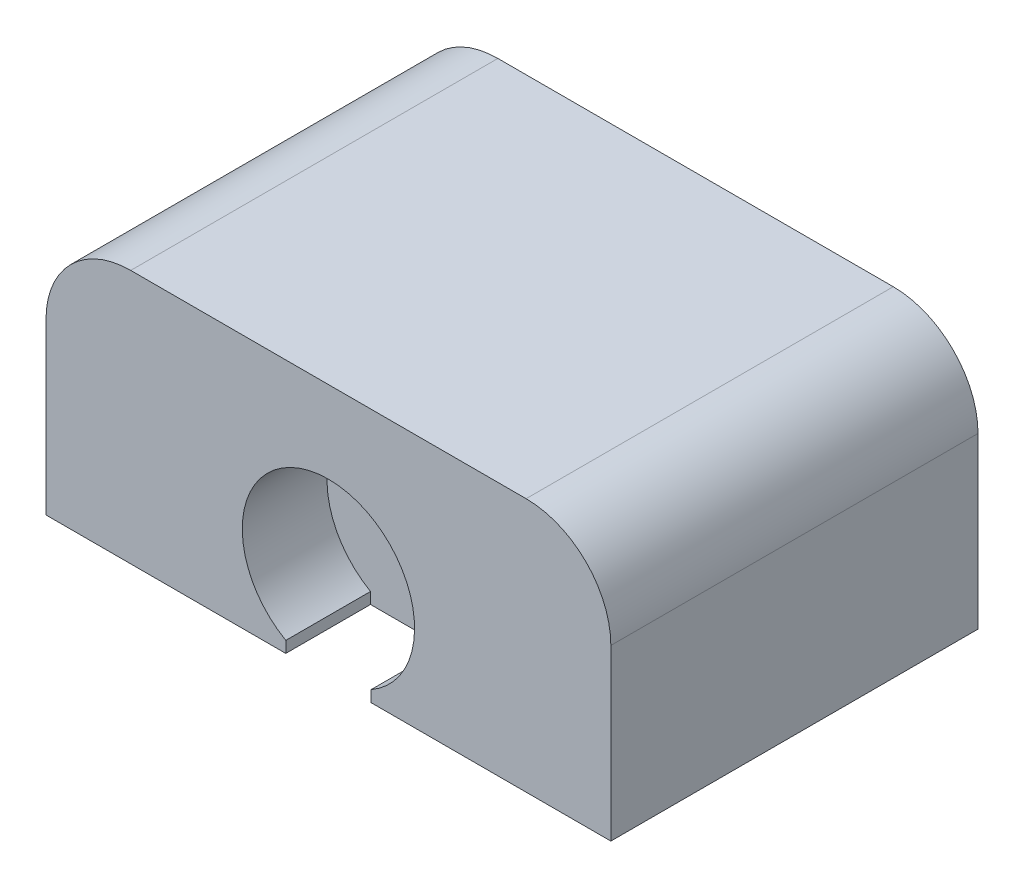
ISO-10303-21;
HEADER;
FILE_DESCRIPTION(('STEP AP214'),'2;1');
FILE_NAME('part.step','',(''),(''),'','','');
FILE_SCHEMA(('AUTOMOTIVE_DESIGN { 1 0 10303 214 1 1 1 1 }'));
ENDSEC;
DATA;
#1=APPLICATION_CONTEXT('core data for automotive mechanical design processes');
#2=APPLICATION_PROTOCOL_DEFINITION('international standard','automotive_design',2000,#1);
#3=PRODUCT_CONTEXT('',#1,'mechanical');
#4=PRODUCT('Part','Part','',(#3));
#5=PRODUCT_RELATED_PRODUCT_CATEGORY('part','',(#4));
#6=PRODUCT_DEFINITION_FORMATION('','',#4);
#7=PRODUCT_DEFINITION_CONTEXT('part definition',#1,'design');
#8=PRODUCT_DEFINITION('design','',#6,#7);
#9=PRODUCT_DEFINITION_SHAPE('','',#8);
#10=(LENGTH_UNIT() NAMED_UNIT(*) SI_UNIT(.MILLI.,.METRE.));
#11=(NAMED_UNIT(*) PLANE_ANGLE_UNIT() SI_UNIT($,.RADIAN.));
#12=(NAMED_UNIT(*) SI_UNIT($,.STERADIAN.) SOLID_ANGLE_UNIT());
#13=UNCERTAINTY_MEASURE_WITH_UNIT(LENGTH_MEASURE(1.E-05),#10,'distance_accuracy_value','');
#14=(GEOMETRIC_REPRESENTATION_CONTEXT(3) GLOBAL_UNCERTAINTY_ASSIGNED_CONTEXT((#13)) GLOBAL_UNIT_ASSIGNED_CONTEXT((#10,
#11,#12)) REPRESENTATION_CONTEXT('',''));
#15=CARTESIAN_POINT('',(0.,0.,0.));
#16=DIRECTION('',(0.,0.,1.));
#17=DIRECTION('',(1.,0.,0.));
#18=AXIS2_PLACEMENT_3D('',#15,#16,#17);
#19=CARTESIAN_POINT('',(-10.,4.5,13.));
#20=DIRECTION('',(1.,0.,0.));
#21=DIRECTION('',(0.,0.,-1.));
#22=AXIS2_PLACEMENT_3D('',#19,#20,#21);
#23=PLANE('',#22);
#24=DIRECTION('',(0.,-1.,0.));
#25=VECTOR('',#24,1.);
#26=CARTESIAN_POINT('',(-10.,4.5,13.));
#27=LINE('',#26,#25);
#28=CARTESIAN_POINT('',(-10.,1.5,13.));
#29=VERTEX_POINT('',#28);
#30=CARTESIAN_POINT('',(-10.,-4.5,13.));
#31=VERTEX_POINT('',#30);
#32=EDGE_CURVE('E169',#29,#31,#27,.T.);
#33=ORIENTED_EDGE('',*,*,#32,.F.);
#34=DIRECTION('',(0.,0.,-1.));
#35=VECTOR('',#34,1.);
#36=CARTESIAN_POINT('',(-10.,1.5,13.));
#37=LINE('',#36,#35);
#38=CARTESIAN_POINT('',(-10.,1.5,0.));
#39=VERTEX_POINT('',#38);
#40=EDGE_CURVE('E202',#29,#39,#37,.T.);
#41=ORIENTED_EDGE('',*,*,#40,.T.);
#42=DIRECTION('',(0.,-1.,0.));
#43=VECTOR('',#42,1.);
#44=CARTESIAN_POINT('',(-10.,4.5,0.));
#45=LINE('',#44,#43);
#46=CARTESIAN_POINT('',(-10.,-4.5,0.));
#47=VERTEX_POINT('',#46);
#48=EDGE_CURVE('E163',#39,#47,#45,.T.);
#49=ORIENTED_EDGE('',*,*,#48,.T.);
#50=DIRECTION('',(0.,0.,-1.));
#51=VECTOR('',#50,1.);
#52=CARTESIAN_POINT('',(-10.,-4.5,13.));
#53=LINE('',#52,#51);
#54=EDGE_CURVE('E198',#31,#47,#53,.T.);
#55=ORIENTED_EDGE('',*,*,#54,.F.);
#56=EDGE_LOOP('',(#33,#41,#49,#55));
#57=FACE_BOUND('',#56,.T.);
#58=ADVANCED_FACE('F39',(#57),#23,.F.);
#59=CARTESIAN_POINT('',(10.,-4.5,13.));
#60=DIRECTION('',(0.,1.,0.));
#61=DIRECTION('',(-1.,0.,0.));
#62=AXIS2_PLACEMENT_3D('',#59,#60,#61);
#63=PLANE('',#62);
#64=DIRECTION('',(1.,0.,0.));
#65=VECTOR('',#64,1.);
#66=CARTESIAN_POINT('',(10.,-4.5,13.));
#67=LINE('',#66,#65);
#68=CARTESIAN_POINT('',(1.51,-4.5,13.));
#69=VERTEX_POINT('',#68);
#70=CARTESIAN_POINT('',(10.,-4.5,13.));
#71=VERTEX_POINT('',#70);
#72=EDGE_CURVE('E172',#69,#71,#67,.T.);
#73=ORIENTED_EDGE('',*,*,#72,.F.);
#74=DIRECTION('',(0.,0.,1.));
#75=VECTOR('',#74,1.);
#76=CARTESIAN_POINT('',(1.51,-4.5,10.));
#77=LINE('',#76,#75);
#78=CARTESIAN_POINT('',(1.51,-4.5,10.));
#79=VERTEX_POINT('',#78);
#80=EDGE_CURVE('E164',#79,#69,#77,.T.);
#81=ORIENTED_EDGE('',*,*,#80,.F.);
#82=DIRECTION('',(1.,0.,0.));
#83=VECTOR('',#82,1.);
#84=CARTESIAN_POINT('',(0.,-4.5,10.));
#85=LINE('',#84,#83);
#86=CARTESIAN_POINT('',(-1.51,-4.5,10.));
#87=VERTEX_POINT('',#86);
#88=EDGE_CURVE('E130',#87,#79,#85,.T.);
#89=ORIENTED_EDGE('',*,*,#88,.F.);
#90=DIRECTION('',(0.,0.,1.));
#91=VECTOR('',#90,1.);
#92=CARTESIAN_POINT('',(-1.51,-4.5,10.));
#93=LINE('',#92,#91);
#94=CARTESIAN_POINT('',(-1.51,-4.5,13.));
#95=VERTEX_POINT('',#94);
#96=EDGE_CURVE('E125',#87,#95,#93,.T.);
#97=ORIENTED_EDGE('',*,*,#96,.T.);
#98=EDGE_CURVE('E174',#31,#95,#67,.T.);
#99=ORIENTED_EDGE('',*,*,#98,.F.);
#100=ORIENTED_EDGE('',*,*,#54,.T.);
#101=DIRECTION('',(1.,0.,0.));
#102=VECTOR('',#101,1.);
#103=CARTESIAN_POINT('',(10.,-4.5,0.));
#104=LINE('',#103,#102);
#105=CARTESIAN_POINT('',(10.,-4.5,0.));
#106=VERTEX_POINT('',#105);
#107=EDGE_CURVE('E187',#47,#106,#104,.T.);
#108=ORIENTED_EDGE('',*,*,#107,.T.);
#109=DIRECTION('',(0.,0.,-1.));
#110=VECTOR('',#109,1.);
#111=CARTESIAN_POINT('',(10.,-4.5,13.));
#112=LINE('',#111,#110);
#113=EDGE_CURVE('E184',#71,#106,#112,.T.);
#114=ORIENTED_EDGE('',*,*,#113,.F.);
#115=EDGE_LOOP('',(#73,#81,#89,#97,#99,#100,#108,#114));
#116=FACE_BOUND('',#115,.T.);
#117=ADVANCED_FACE('F245',(#116),#63,.F.);
#118=CARTESIAN_POINT('',(10.,4.5,13.));
#119=DIRECTION('',(-1.,0.,0.));
#120=DIRECTION('',(0.,0.,1.));
#121=AXIS2_PLACEMENT_3D('',#118,#119,#120);
#122=PLANE('',#121);
#123=DIRECTION('',(0.,1.,0.));
#124=VECTOR('',#123,1.);
#125=CARTESIAN_POINT('',(10.,4.5,0.));
#126=LINE('',#125,#124);
#127=CARTESIAN_POINT('',(10.,1.5,0.));
#128=VERTEX_POINT('',#127);
#129=EDGE_CURVE('E190',#106,#128,#126,.T.);
#130=ORIENTED_EDGE('',*,*,#129,.T.);
#131=DIRECTION('',(0.,0.,-1.));
#132=VECTOR('',#131,1.);
#133=CARTESIAN_POINT('',(10.,1.5,13.));
#134=LINE('',#133,#132);
#135=CARTESIAN_POINT('',(10.,1.5,13.));
#136=VERTEX_POINT('',#135);
#137=EDGE_CURVE('E11',#128,#136,#134,.F.);
#138=ORIENTED_EDGE('',*,*,#137,.T.);
#139=DIRECTION('',(0.,1.,0.));
#140=VECTOR('',#139,1.);
#141=CARTESIAN_POINT('',(10.,4.5,13.));
#142=LINE('',#141,#140);
#143=EDGE_CURVE('E178',#71,#136,#142,.T.);
#144=ORIENTED_EDGE('',*,*,#143,.F.);
#145=ORIENTED_EDGE('',*,*,#113,.T.);
#146=EDGE_LOOP('',(#130,#138,#144,#145));
#147=FACE_BOUND('',#146,.T.);
#148=ADVANCED_FACE('F241',(#147),#122,.F.);
#149=CARTESIAN_POINT('',(10.,4.5,13.));
#150=DIRECTION('',(0.,-1.,0.));
#151=DIRECTION('',(1.,0.,0.));
#152=AXIS2_PLACEMENT_3D('',#149,#150,#151);
#153=PLANE('',#152);
#154=DIRECTION('',(-1.,0.,0.));
#155=VECTOR('',#154,1.);
#156=CARTESIAN_POINT('',(10.,4.5,0.));
#157=LINE('',#156,#155);
#158=CARTESIAN_POINT('',(7.,4.5,0.));
#159=VERTEX_POINT('',#158);
#160=CARTESIAN_POINT('',(-7.,4.5,0.));
#161=VERTEX_POINT('',#160);
#162=EDGE_CURVE('E173',#159,#161,#157,.T.);
#163=ORIENTED_EDGE('',*,*,#162,.T.);
#164=DIRECTION('',(0.,0.,-1.));
#165=VECTOR('',#164,1.);
#166=CARTESIAN_POINT('',(-7.,4.5,13.));
#167=LINE('',#166,#165);
#168=CARTESIAN_POINT('',(-7.,4.5,13.));
#169=VERTEX_POINT('',#168);
#170=EDGE_CURVE('E61',#161,#169,#167,.F.);
#171=ORIENTED_EDGE('',*,*,#170,.T.);
#172=DIRECTION('',(-1.,0.,0.));
#173=VECTOR('',#172,1.);
#174=CARTESIAN_POINT('',(10.,4.5,13.));
#175=LINE('',#174,#173);
#176=CARTESIAN_POINT('',(7.,4.5,13.));
#177=VERTEX_POINT('',#176);
#178=EDGE_CURVE('E181',#177,#169,#175,.T.);
#179=ORIENTED_EDGE('',*,*,#178,.F.);
#180=DIRECTION('',(0.,0.,-1.));
#181=VECTOR('',#180,1.);
#182=CARTESIAN_POINT('',(7.,4.5,13.));
#183=LINE('',#182,#181);
#184=EDGE_CURVE('E212',#177,#159,#183,.T.);
#185=ORIENTED_EDGE('',*,*,#184,.T.);
#186=EDGE_LOOP('',(#163,#171,#179,#185));
#187=FACE_BOUND('',#186,.T.);
#188=ADVANCED_FACE('F236',(#187),#153,.F.);
#189=CARTESIAN_POINT('',(0.,0.,13.));
#190=DIRECTION('',(0.,0.,-1.));
#191=DIRECTION('',(-1.,0.,0.));
#192=AXIS2_PLACEMENT_3D('',#189,#190,#191);
#193=PLANE('',#192);
#194=ORIENTED_EDGE('',*,*,#178,.T.);
#195=CARTESIAN_POINT('',(-7.,1.5,13.));
#196=DIRECTION('',(0.,0.,-1.));
#197=DIRECTION('',(-1.,0.,0.));
#198=AXIS2_PLACEMENT_3D('',#195,#196,#197);
#199=CIRCLE('',#198,3.);
#200=EDGE_CURVE('E48',#169,#29,#199,.F.);
#201=ORIENTED_EDGE('',*,*,#200,.T.);
#202=ORIENTED_EDGE('',*,*,#32,.T.);
#203=ORIENTED_EDGE('',*,*,#98,.T.);
#204=DIRECTION('',(0.,1.,0.));
#205=VECTOR('',#204,1.);
#206=CARTESIAN_POINT('',(-1.51,0.,13.));
#207=LINE('',#206,#205);
#208=CARTESIAN_POINT('',(-1.51,-4.0999811320083,13.));
#209=VERTEX_POINT('',#208);
#210=EDGE_CURVE('E149',#95,#209,#207,.T.);
#211=ORIENTED_EDGE('',*,*,#210,.T.);
#212=CARTESIAN_POINT('',(0.,-1.45,13.));
#213=DIRECTION('',(0.,0.,1.));
#214=DIRECTION('',(1.,0.,0.));
#215=AXIS2_PLACEMENT_3D('',#212,#213,#214);
#216=CIRCLE('',#215,3.05);
#217=CARTESIAN_POINT('',(1.51,-4.0999811320083,13.));
#218=VERTEX_POINT('',#217);
#219=EDGE_CURVE('E138',#218,#209,#216,.T.);
#220=ORIENTED_EDGE('',*,*,#219,.F.);
#221=DIRECTION('',(0.,1.,0.));
#222=VECTOR('',#221,1.);
#223=CARTESIAN_POINT('',(1.51,0.,13.));
#224=LINE('',#223,#222);
#225=EDGE_CURVE('E145',#69,#218,#224,.T.);
#226=ORIENTED_EDGE('',*,*,#225,.F.);
#227=ORIENTED_EDGE('',*,*,#72,.T.);
#228=ORIENTED_EDGE('',*,*,#143,.T.);
#229=CARTESIAN_POINT('',(7.,1.5,13.));
#230=DIRECTION('',(0.,0.,-1.));
#231=DIRECTION('',(-1.,0.,0.));
#232=AXIS2_PLACEMENT_3D('',#229,#230,#231);
#233=CIRCLE('',#232,3.);
#234=EDGE_CURVE('E218',#136,#177,#233,.F.);
#235=ORIENTED_EDGE('',*,*,#234,.T.);
#236=EDGE_LOOP('',(#194,#201,#202,#203,#211,#220,#226,#227,#228,#235));
#237=FACE_BOUND('',#236,.T.);
#238=ADVANCED_FACE('F224',(#237),#193,.F.);
#239=CARTESIAN_POINT('',(0.,0.,0.));
#240=DIRECTION('',(0.,0.,-1.));
#241=DIRECTION('',(-1.,0.,0.));
#242=AXIS2_PLACEMENT_3D('',#239,#240,#241);
#243=PLANE('',#242);
#244=ORIENTED_EDGE('',*,*,#48,.F.);
#245=CARTESIAN_POINT('',(-7.,1.5,0.));
#246=DIRECTION('',(0.,0.,-1.));
#247=DIRECTION('',(-1.,0.,0.));
#248=AXIS2_PLACEMENT_3D('',#245,#246,#247);
#249=CIRCLE('',#248,3.);
#250=EDGE_CURVE('E209',#39,#161,#249,.T.);
#251=ORIENTED_EDGE('',*,*,#250,.T.);
#252=ORIENTED_EDGE('',*,*,#162,.F.);
#253=CARTESIAN_POINT('',(7.,1.5,0.));
#254=DIRECTION('',(0.,0.,-1.));
#255=DIRECTION('',(-1.,0.,0.));
#256=AXIS2_PLACEMENT_3D('',#253,#254,#255);
#257=CIRCLE('',#256,3.);
#258=EDGE_CURVE('E206',#159,#128,#257,.T.);
#259=ORIENTED_EDGE('',*,*,#258,.T.);
#260=ORIENTED_EDGE('',*,*,#129,.F.);
#261=ORIENTED_EDGE('',*,*,#107,.F.);
#262=EDGE_LOOP('',(#244,#251,#252,#259,#260,#261));
#263=FACE_BOUND('',#262,.T.);
#264=ADVANCED_FACE('F234',(#263),#243,.T.);
#265=CARTESIAN_POINT('',(0.,-1.45,10.));
#266=DIRECTION('',(0.,0.,1.));
#267=DIRECTION('',(1.,0.,0.));
#268=AXIS2_PLACEMENT_3D('',#265,#266,#267);
#269=CYLINDRICAL_SURFACE('',#268,3.05);
#270=ORIENTED_EDGE('',*,*,#219,.T.);
#271=DIRECTION('',(0.,0.,1.));
#272=VECTOR('',#271,1.);
#273=CARTESIAN_POINT('',(-1.51,-4.0999811320083,10.));
#274=LINE('',#273,#272);
#275=CARTESIAN_POINT('',(-1.51,-4.0999811320083,10.));
#276=VERTEX_POINT('',#275);
#277=EDGE_CURVE('E122',#276,#209,#274,.T.);
#278=ORIENTED_EDGE('',*,*,#277,.F.);
#279=CARTESIAN_POINT('',(0.,-1.45,10.));
#280=DIRECTION('',(0.,0.,1.));
#281=DIRECTION('',(1.,0.,0.));
#282=AXIS2_PLACEMENT_3D('',#279,#280,#281);
#283=CIRCLE('',#282,3.05);
#284=CARTESIAN_POINT('',(1.51,-4.0999811320083,10.));
#285=VERTEX_POINT('',#284);
#286=EDGE_CURVE('E131',#285,#276,#283,.T.);
#287=ORIENTED_EDGE('',*,*,#286,.F.);
#288=DIRECTION('',(0.,0.,1.));
#289=VECTOR('',#288,1.);
#290=CARTESIAN_POINT('',(1.51,-4.0999811320083,10.));
#291=LINE('',#290,#289);
#292=EDGE_CURVE('E160',#285,#218,#291,.T.);
#293=ORIENTED_EDGE('',*,*,#292,.T.);
#294=EDGE_LOOP('',(#270,#278,#287,#293));
#295=FACE_BOUND('',#294,.T.);
#296=ADVANCED_FACE('F135',(#295),#269,.F.);
#297=CARTESIAN_POINT('',(1.51,0.,10.));
#298=DIRECTION('',(1.,0.,0.));
#299=DIRECTION('',(0.,1.,0.));
#300=AXIS2_PLACEMENT_3D('',#297,#298,#299);
#301=PLANE('',#300);
#302=ORIENTED_EDGE('',*,*,#225,.T.);
#303=ORIENTED_EDGE('',*,*,#292,.F.);
#304=DIRECTION('',(0.,1.,0.));
#305=VECTOR('',#304,1.);
#306=CARTESIAN_POINT('',(1.51,0.,10.));
#307=LINE('',#306,#305);
#308=EDGE_CURVE('E140',#79,#285,#307,.T.);
#309=ORIENTED_EDGE('',*,*,#308,.F.);
#310=ORIENTED_EDGE('',*,*,#80,.T.);
#311=EDGE_LOOP('',(#302,#303,#309,#310));
#312=FACE_BOUND('',#311,.T.);
#313=ADVANCED_FACE('F249',(#312),#301,.F.);
#314=CARTESIAN_POINT('',(-1.51,0.,10.));
#315=DIRECTION('',(1.,0.,0.));
#316=DIRECTION('',(0.,0.,-1.));
#317=AXIS2_PLACEMENT_3D('',#314,#315,#316);
#318=PLANE('',#317);
#319=ORIENTED_EDGE('',*,*,#210,.F.);
#320=ORIENTED_EDGE('',*,*,#96,.F.);
#321=DIRECTION('',(0.,1.,0.));
#322=VECTOR('',#321,1.);
#323=CARTESIAN_POINT('',(-1.51,0.,10.));
#324=LINE('',#323,#322);
#325=EDGE_CURVE('E119',#87,#276,#324,.T.);
#326=ORIENTED_EDGE('',*,*,#325,.T.);
#327=ORIENTED_EDGE('',*,*,#277,.T.);
#328=EDGE_LOOP('',(#319,#320,#326,#327));
#329=FACE_BOUND('',#328,.T.);
#330=ADVANCED_FACE('F121',(#329),#318,.T.);
#331=CARTESIAN_POINT('',(0.,0.,10.));
#332=DIRECTION('',(0.,0.,1.));
#333=DIRECTION('',(1.,0.,0.));
#334=AXIS2_PLACEMENT_3D('',#331,#332,#333);
#335=PLANE('',#334);
#336=ORIENTED_EDGE('',*,*,#286,.T.);
#337=ORIENTED_EDGE('',*,*,#325,.F.);
#338=ORIENTED_EDGE('',*,*,#88,.T.);
#339=ORIENTED_EDGE('',*,*,#308,.T.);
#340=EDGE_LOOP('',(#336,#337,#338,#339));
#341=FACE_BOUND('',#340,.T.);
#342=ADVANCED_FACE('F142',(#341),#335,.T.);
#343=CARTESIAN_POINT('',(-7.,1.5,13.));
#344=DIRECTION('',(0.,0.,-1.));
#345=DIRECTION('',(-1.,0.,0.));
#346=AXIS2_PLACEMENT_3D('',#343,#344,#345);
#347=CYLINDRICAL_SURFACE('',#346,3.);
#348=ORIENTED_EDGE('',*,*,#200,.F.);
#349=ORIENTED_EDGE('',*,*,#170,.F.);
#350=ORIENTED_EDGE('',*,*,#250,.F.);
#351=ORIENTED_EDGE('',*,*,#40,.F.);
#352=EDGE_LOOP('',(#348,#349,#350,#351));
#353=FACE_BOUND('',#352,.T.);
#354=ADVANCED_FACE('F231',(#353),#347,.T.);
#355=CARTESIAN_POINT('',(7.,1.5,13.));
#356=DIRECTION('',(0.,0.,-1.));
#357=DIRECTION('',(-1.,0.,0.));
#358=AXIS2_PLACEMENT_3D('',#355,#356,#357);
#359=CYLINDRICAL_SURFACE('',#358,3.);
#360=ORIENTED_EDGE('',*,*,#234,.F.);
#361=ORIENTED_EDGE('',*,*,#137,.F.);
#362=ORIENTED_EDGE('',*,*,#258,.F.);
#363=ORIENTED_EDGE('',*,*,#184,.F.);
#364=EDGE_LOOP('',(#360,#361,#362,#363));
#365=FACE_BOUND('',#364,.T.);
#366=ADVANCED_FACE('F41',(#365),#359,.T.);
#367=CLOSED_SHELL('',(#58,#117,#148,#188,#238,#264,#296,#313,#330,#342,#354,#366));
#368=MANIFOLD_SOLID_BREP('B2',#367);
#369=ADVANCED_BREP_SHAPE_REPRESENTATION('',(#18,#368),#14);
#370=SHAPE_DEFINITION_REPRESENTATION(#9,#369);
ENDSEC;
END-ISO-10303-21;
